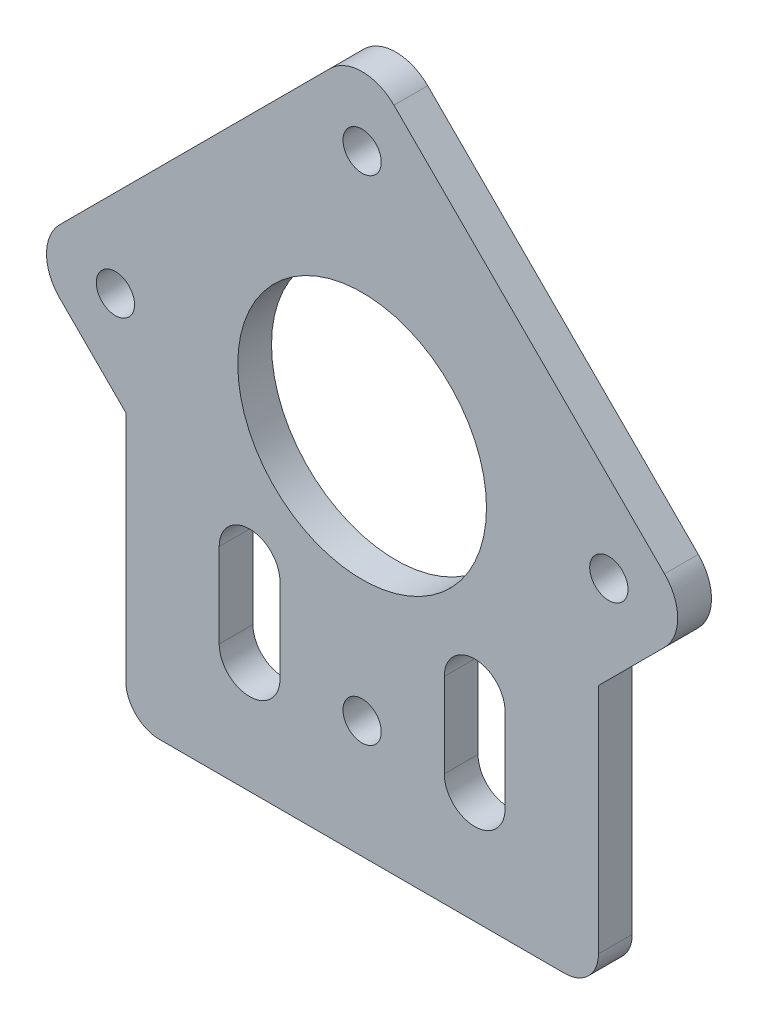
ISO-10303-21;
HEADER;
FILE_DESCRIPTION(('STEP AP214'),'2;1');
FILE_NAME('part.step','',(''),(''),'','','');
FILE_SCHEMA(('AUTOMOTIVE_DESIGN { 1 0 10303 214 1 1 1 1 }'));
ENDSEC;
DATA;
#1=APPLICATION_CONTEXT('core data for automotive mechanical design processes');
#2=APPLICATION_PROTOCOL_DEFINITION('international standard','automotive_design',2000,#1);
#3=PRODUCT_CONTEXT('',#1,'mechanical');
#4=PRODUCT('Part','Part','',(#3));
#5=PRODUCT_RELATED_PRODUCT_CATEGORY('part','',(#4));
#6=PRODUCT_DEFINITION_FORMATION('','',#4);
#7=PRODUCT_DEFINITION_CONTEXT('part definition',#1,'design');
#8=PRODUCT_DEFINITION('design','',#6,#7);
#9=PRODUCT_DEFINITION_SHAPE('','',#8);
#10=(LENGTH_UNIT() NAMED_UNIT(*) SI_UNIT(.MILLI.,.METRE.));
#11=(NAMED_UNIT(*) PLANE_ANGLE_UNIT() SI_UNIT($,.RADIAN.));
#12=(NAMED_UNIT(*) SI_UNIT($,.STERADIAN.) SOLID_ANGLE_UNIT());
#13=UNCERTAINTY_MEASURE_WITH_UNIT(LENGTH_MEASURE(1.E-05),#10,'distance_accuracy_value','');
#14=(GEOMETRIC_REPRESENTATION_CONTEXT(3) GLOBAL_UNCERTAINTY_ASSIGNED_CONTEXT((#13)) GLOBAL_UNIT_ASSIGNED_CONTEXT((#10,
#11,#12)) REPRESENTATION_CONTEXT('',''));
#15=CARTESIAN_POINT('',(0.,0.,0.));
#16=DIRECTION('',(0.,0.,1.));
#17=DIRECTION('',(1.,0.,0.));
#18=AXIS2_PLACEMENT_3D('',#15,#16,#17);
#19=CARTESIAN_POINT('',(54.0416305603426,32.35,3.));
#20=DIRECTION('',(0.,0.,1.));
#21=DIRECTION('',(1.,0.,0.));
#22=AXIS2_PLACEMENT_3D('',#19,#20,#21);
#23=PLANE('',#22);
#24=DIRECTION('',(0.,-1.,0.));
#25=VECTOR('',#24,1.);
#26=CARTESIAN_POINT('',(17.3,17.5,3.));
#27=LINE('',#26,#25);
#28=CARTESIAN_POINT('',(17.3,17.5,3.));
#29=VERTEX_POINT('',#28);
#30=CARTESIAN_POINT('',(17.3,10.,3.));
#31=VERTEX_POINT('',#30);
#32=EDGE_CURVE('E208',#29,#31,#27,.T.);
#33=ORIENTED_EDGE('',*,*,#32,.F.);
#34=CARTESIAN_POINT('',(20.,17.5,3.));
#35=DIRECTION('',(0.,0.,1.));
#36=DIRECTION('',(1.,0.,0.));
#37=AXIS2_PLACEMENT_3D('',#34,#35,#36);
#38=CIRCLE('',#37,2.7);
#39=CARTESIAN_POINT('',(22.7,17.5,3.));
#40=VERTEX_POINT('',#39);
#41=EDGE_CURVE('E206',#40,#29,#38,.T.);
#42=ORIENTED_EDGE('',*,*,#41,.F.);
#43=DIRECTION('',(0.,1.,0.));
#44=VECTOR('',#43,1.);
#45=CARTESIAN_POINT('',(22.7,10.,3.));
#46=LINE('',#45,#44);
#47=CARTESIAN_POINT('',(22.7,10.,3.));
#48=VERTEX_POINT('',#47);
#49=EDGE_CURVE('E214',#48,#40,#46,.T.);
#50=ORIENTED_EDGE('',*,*,#49,.F.);
#51=CARTESIAN_POINT('',(20.,10.,3.));
#52=DIRECTION('',(0.,0.,1.));
#53=DIRECTION('',(1.,0.,0.));
#54=AXIS2_PLACEMENT_3D('',#51,#52,#53);
#55=CIRCLE('',#54,2.7);
#56=EDGE_CURVE('E211',#31,#48,#55,.T.);
#57=ORIENTED_EDGE('',*,*,#56,.F.);
#58=EDGE_LOOP('',(#33,#42,#50,#57));
#59=FACE_BOUND('',#58,.T.);
#60=CARTESIAN_POINT('',(8.07968978321703,32.35,3.));
#61=DIRECTION('',(0.,0.,1.));
#62=DIRECTION('',(1.,0.,0.));
#63=AXIS2_PLACEMENT_3D('',#60,#61,#62);
#64=CIRCLE('',#63,1.7);
#65=CARTESIAN_POINT('',(9.77968978321703,32.35,3.));
#66=VERTEX_POINT('',#65);
#67=EDGE_CURVE('E243',#66,#66,#64,.T.);
#68=ORIENTED_EDGE('',*,*,#67,.F.);
#69=EDGE_LOOP('',(#68));
#70=FACE_BOUND('',#69,.T.);
#71=CARTESIAN_POINT('',(51.920310216783,32.35,3.));
#72=DIRECTION('',(0.,0.,1.));
#73=DIRECTION('',(1.,0.,0.));
#74=AXIS2_PLACEMENT_3D('',#71,#72,#73);
#75=CIRCLE('',#74,1.7);
#76=CARTESIAN_POINT('',(53.620310216783,32.35,3.));
#77=VERTEX_POINT('',#76);
#78=EDGE_CURVE('E255',#77,#77,#75,.T.);
#79=ORIENTED_EDGE('',*,*,#78,.F.);
#80=EDGE_LOOP('',(#79));
#81=FACE_BOUND('',#80,.T.);
#82=CARTESIAN_POINT('',(54.0416305603426,32.35,3.));
#83=DIRECTION('',(0.,0.,1.));
#84=DIRECTION('',(1.,0.,0.));
#85=AXIS2_PLACEMENT_3D('',#82,#83,#84);
#86=CIRCLE('',#85,4.);
#87=CARTESIAN_POINT('',(56.8700576850888,29.5215728752538,3.));
#88=VERTEX_POINT('',#87);
#89=CARTESIAN_POINT('',(56.8700576850888,35.1784271247462,3.));
#90=VERTEX_POINT('',#89);
#91=EDGE_CURVE('E267',#88,#90,#86,.T.);
#92=ORIENTED_EDGE('',*,*,#91,.T.);
#93=DIRECTION('',(-0.707106781186548,0.707106781186547,0.));
#94=VECTOR('',#93,1.);
#95=CARTESIAN_POINT('',(56.8700576850888,35.1784271247462,3.));
#96=LINE('',#95,#94);
#97=CARTESIAN_POINT('',(32.8284271247462,59.2200576850888,3.));
#98=VERTEX_POINT('',#97);
#99=EDGE_CURVE('E270',#90,#98,#96,.T.);
#100=ORIENTED_EDGE('',*,*,#99,.T.);
#101=CARTESIAN_POINT('',(30.,56.3916305603426,3.));
#102=DIRECTION('',(0.,0.,1.));
#103=DIRECTION('',(1.,0.,0.));
#104=AXIS2_PLACEMENT_3D('',#101,#102,#103);
#105=CIRCLE('',#104,4.);
#106=CARTESIAN_POINT('',(27.1715728752538,59.2200576850888,3.));
#107=VERTEX_POINT('',#106);
#108=EDGE_CURVE('E273',#98,#107,#105,.T.);
#109=ORIENTED_EDGE('',*,*,#108,.T.);
#110=DIRECTION('',(-0.707106781186547,-0.707106781186547,0.));
#111=VECTOR('',#110,1.);
#112=CARTESIAN_POINT('',(27.1715728752538,59.2200576850888,3.));
#113=LINE('',#112,#111);
#114=CARTESIAN_POINT('',(3.1299423149112,35.1784271247462,3.));
#115=VERTEX_POINT('',#114);
#116=EDGE_CURVE('E275',#107,#115,#113,.T.);
#117=ORIENTED_EDGE('',*,*,#116,.T.);
#118=CARTESIAN_POINT('',(5.95836943965739,32.35,3.));
#119=DIRECTION('',(0.,0.,1.));
#120=DIRECTION('',(1.,0.,0.));
#121=AXIS2_PLACEMENT_3D('',#118,#119,#120);
#122=CIRCLE('',#121,4.);
#123=CARTESIAN_POINT('',(3.1299423149112,29.5215728752538,3.));
#124=VERTEX_POINT('',#123);
#125=EDGE_CURVE('E277',#115,#124,#122,.T.);
#126=ORIENTED_EDGE('',*,*,#125,.T.);
#127=DIRECTION('',(0.707106781186548,-0.707106781186547,0.));
#128=VECTOR('',#127,1.);
#129=CARTESIAN_POINT('',(3.1299423149112,29.5215728752538,3.));
#130=LINE('',#129,#128);
#131=CARTESIAN_POINT('',(9.,23.651515190165,3.));
#132=VERTEX_POINT('',#131);
#133=EDGE_CURVE('E279',#124,#132,#130,.T.);
#134=ORIENTED_EDGE('',*,*,#133,.T.);
#135=DIRECTION('',(0.,-1.,0.));
#136=VECTOR('',#135,1.);
#137=CARTESIAN_POINT('',(9.,23.651515190165,3.));
#138=LINE('',#137,#136);
#139=CARTESIAN_POINT('',(9.,3.,3.));
#140=VERTEX_POINT('',#139);
#141=EDGE_CURVE('E281',#132,#140,#138,.T.);
#142=ORIENTED_EDGE('',*,*,#141,.T.);
#143=CARTESIAN_POINT('',(12.,3.,3.));
#144=DIRECTION('',(0.,0.,1.));
#145=DIRECTION('',(1.,0.,0.));
#146=AXIS2_PLACEMENT_3D('',#143,#144,#145);
#147=CIRCLE('',#146,3.);
#148=CARTESIAN_POINT('',(12.,0.,3.));
#149=VERTEX_POINT('',#148);
#150=EDGE_CURVE('E283',#140,#149,#147,.T.);
#151=ORIENTED_EDGE('',*,*,#150,.T.);
#152=DIRECTION('',(1.,0.,0.));
#153=VECTOR('',#152,1.);
#154=CARTESIAN_POINT('',(12.,0.,3.));
#155=LINE('',#154,#153);
#156=CARTESIAN_POINT('',(48.,0.,3.));
#157=VERTEX_POINT('',#156);
#158=EDGE_CURVE('E285',#149,#157,#155,.T.);
#159=ORIENTED_EDGE('',*,*,#158,.T.);
#160=CARTESIAN_POINT('',(48.,3.,3.));
#161=DIRECTION('',(0.,0.,1.));
#162=DIRECTION('',(1.,0.,0.));
#163=AXIS2_PLACEMENT_3D('',#160,#161,#162);
#164=CIRCLE('',#163,3.);
#165=CARTESIAN_POINT('',(51.,3.,3.));
#166=VERTEX_POINT('',#165);
#167=EDGE_CURVE('E287',#157,#166,#164,.T.);
#168=ORIENTED_EDGE('',*,*,#167,.T.);
#169=DIRECTION('',(0.,1.,0.));
#170=VECTOR('',#169,1.);
#171=CARTESIAN_POINT('',(51.,3.,3.));
#172=LINE('',#171,#170);
#173=CARTESIAN_POINT('',(51.,23.651515190165,3.));
#174=VERTEX_POINT('',#173);
#175=EDGE_CURVE('E289',#166,#174,#172,.T.);
#176=ORIENTED_EDGE('',*,*,#175,.T.);
#177=DIRECTION('',(0.707106781186547,0.707106781186547,0.));
#178=VECTOR('',#177,1.);
#179=CARTESIAN_POINT('',(51.,23.651515190165,3.));
#180=LINE('',#179,#178);
#181=EDGE_CURVE('E291',#174,#88,#180,.T.);
#182=ORIENTED_EDGE('',*,*,#181,.T.);
#183=EDGE_LOOP('',(#92,#100,#109,#117,#126,#134,#142,#151,#159,#168,#176,#182));
#184=FACE_BOUND('',#183,.T.);
#185=CARTESIAN_POINT('',(30.,10.429689783217,3.));
#186=DIRECTION('',(0.,0.,1.));
#187=DIRECTION('',(1.,0.,0.));
#188=AXIS2_PLACEMENT_3D('',#185,#186,#187);
#189=CIRCLE('',#188,1.7);
#190=CARTESIAN_POINT('',(31.7,10.429689783217,3.));
#191=VERTEX_POINT('',#190);
#192=EDGE_CURVE('E261',#191,#191,#189,.T.);
#193=ORIENTED_EDGE('',*,*,#192,.F.);
#194=EDGE_LOOP('',(#193));
#195=FACE_BOUND('',#194,.T.);
#196=CARTESIAN_POINT('',(30.,54.270310216783,3.));
#197=DIRECTION('',(0.,0.,1.));
#198=DIRECTION('',(1.,0.,0.));
#199=AXIS2_PLACEMENT_3D('',#196,#197,#198);
#200=CIRCLE('',#199,1.7);
#201=CARTESIAN_POINT('',(31.7,54.270310216783,3.));
#202=VERTEX_POINT('',#201);
#203=EDGE_CURVE('E249',#202,#202,#200,.T.);
#204=ORIENTED_EDGE('',*,*,#203,.F.);
#205=EDGE_LOOP('',(#204));
#206=FACE_BOUND('',#205,.T.);
#207=CARTESIAN_POINT('',(30.,32.35,3.));
#208=DIRECTION('',(0.,0.,1.));
#209=DIRECTION('',(1.,0.,0.));
#210=AXIS2_PLACEMENT_3D('',#207,#208,#209);
#211=CIRCLE('',#210,11.05);
#212=CARTESIAN_POINT('',(41.05,32.35,3.));
#213=VERTEX_POINT('',#212);
#214=EDGE_CURVE('E237',#213,#213,#211,.T.);
#215=ORIENTED_EDGE('',*,*,#214,.F.);
#216=EDGE_LOOP('',(#215));
#217=FACE_BOUND('',#216,.T.);
#218=DIRECTION('',(0.,-1.,0.));
#219=VECTOR('',#218,1.);
#220=CARTESIAN_POINT('',(37.3,10.,3.));
#221=LINE('',#220,#219);
#222=CARTESIAN_POINT('',(37.3,17.5,3.));
#223=VERTEX_POINT('',#222);
#224=CARTESIAN_POINT('',(37.3,10.,3.));
#225=VERTEX_POINT('',#224);
#226=EDGE_CURVE('E178',#223,#225,#221,.T.);
#227=ORIENTED_EDGE('',*,*,#226,.F.);
#228=CARTESIAN_POINT('',(40.,17.5,3.));
#229=DIRECTION('',(0.,0.,1.));
#230=DIRECTION('',(1.,0.,0.));
#231=AXIS2_PLACEMENT_3D('',#228,#229,#230);
#232=CIRCLE('',#231,2.7);
#233=CARTESIAN_POINT('',(42.7,17.5,3.));
#234=VERTEX_POINT('',#233);
#235=EDGE_CURVE('E170',#234,#223,#232,.T.);
#236=ORIENTED_EDGE('',*,*,#235,.F.);
#237=DIRECTION('',(0.,1.,0.));
#238=VECTOR('',#237,1.);
#239=CARTESIAN_POINT('',(42.7,17.5,3.));
#240=LINE('',#239,#238);
#241=CARTESIAN_POINT('',(42.7,10.,3.));
#242=VERTEX_POINT('',#241);
#243=EDGE_CURVE('E192',#242,#234,#240,.T.);
#244=ORIENTED_EDGE('',*,*,#243,.F.);
#245=CARTESIAN_POINT('',(40.,10.,3.));
#246=DIRECTION('',(0.,0.,1.));
#247=DIRECTION('',(1.,0.,0.));
#248=AXIS2_PLACEMENT_3D('',#245,#246,#247);
#249=CIRCLE('',#248,2.7);
#250=EDGE_CURVE('E190',#225,#242,#249,.T.);
#251=ORIENTED_EDGE('',*,*,#250,.F.);
#252=EDGE_LOOP('',(#227,#236,#244,#251));
#253=FACE_BOUND('',#252,.T.);
#254=ADVANCED_FACE('F33',(#59,#70,#81,#184,#195,#206,#217,#253),#23,.T.);
#255=CARTESIAN_POINT('',(54.0416305603426,32.35,0.));
#256=DIRECTION('',(0.,0.,1.));
#257=DIRECTION('',(1.,0.,0.));
#258=AXIS2_PLACEMENT_3D('',#255,#256,#257);
#259=PLANE('',#258);
#260=CARTESIAN_POINT('',(20.,17.5,0.));
#261=DIRECTION('',(0.,0.,1.));
#262=DIRECTION('',(1.,0.,0.));
#263=AXIS2_PLACEMENT_3D('',#260,#261,#262);
#264=CIRCLE('',#263,2.7);
#265=CARTESIAN_POINT('',(22.7,17.5,0.));
#266=VERTEX_POINT('',#265);
#267=CARTESIAN_POINT('',(17.3,17.5,0.));
#268=VERTEX_POINT('',#267);
#269=EDGE_CURVE('E186',#266,#268,#264,.T.);
#270=ORIENTED_EDGE('',*,*,#269,.T.);
#271=DIRECTION('',(0.,-1.,0.));
#272=VECTOR('',#271,1.);
#273=CARTESIAN_POINT('',(17.3,17.5,0.));
#274=LINE('',#273,#272);
#275=CARTESIAN_POINT('',(17.3,10.,0.));
#276=VERTEX_POINT('',#275);
#277=EDGE_CURVE('E219',#268,#276,#274,.T.);
#278=ORIENTED_EDGE('',*,*,#277,.T.);
#279=CARTESIAN_POINT('',(20.,10.,0.));
#280=DIRECTION('',(0.,0.,1.));
#281=DIRECTION('',(1.,0.,0.));
#282=AXIS2_PLACEMENT_3D('',#279,#280,#281);
#283=CIRCLE('',#282,2.7);
#284=CARTESIAN_POINT('',(22.7,10.,0.));
#285=VERTEX_POINT('',#284);
#286=EDGE_CURVE('E222',#276,#285,#283,.T.);
#287=ORIENTED_EDGE('',*,*,#286,.T.);
#288=DIRECTION('',(0.,1.,0.));
#289=VECTOR('',#288,1.);
#290=CARTESIAN_POINT('',(22.7,10.,0.));
#291=LINE('',#290,#289);
#292=EDGE_CURVE('E209',#285,#266,#291,.T.);
#293=ORIENTED_EDGE('',*,*,#292,.T.);
#294=EDGE_LOOP('',(#270,#278,#287,#293));
#295=FACE_BOUND('',#294,.T.);
#296=CARTESIAN_POINT('',(8.07968978321703,32.35,0.));
#297=DIRECTION('',(0.,0.,1.));
#298=DIRECTION('',(1.,0.,0.));
#299=AXIS2_PLACEMENT_3D('',#296,#297,#298);
#300=CIRCLE('',#299,1.7);
#301=CARTESIAN_POINT('',(9.77968978321703,32.35,0.));
#302=VERTEX_POINT('',#301);
#303=EDGE_CURVE('E240',#302,#302,#300,.T.);
#304=ORIENTED_EDGE('',*,*,#303,.T.);
#305=EDGE_LOOP('',(#304));
#306=FACE_BOUND('',#305,.T.);
#307=CARTESIAN_POINT('',(51.920310216783,32.35,0.));
#308=DIRECTION('',(0.,0.,1.));
#309=DIRECTION('',(1.,0.,0.));
#310=AXIS2_PLACEMENT_3D('',#307,#308,#309);
#311=CIRCLE('',#310,1.7);
#312=CARTESIAN_POINT('',(53.620310216783,32.35,0.));
#313=VERTEX_POINT('',#312);
#314=EDGE_CURVE('E252',#313,#313,#311,.T.);
#315=ORIENTED_EDGE('',*,*,#314,.T.);
#316=EDGE_LOOP('',(#315));
#317=FACE_BOUND('',#316,.T.);
#318=CARTESIAN_POINT('',(54.0416305603426,32.35,0.));
#319=DIRECTION('',(0.,0.,1.));
#320=DIRECTION('',(1.,0.,0.));
#321=AXIS2_PLACEMENT_3D('',#318,#319,#320);
#322=CIRCLE('',#321,4.);
#323=CARTESIAN_POINT('',(56.8700576850888,29.5215728752538,0.));
#324=VERTEX_POINT('',#323);
#325=CARTESIAN_POINT('',(56.8700576850888,35.1784271247462,0.));
#326=VERTEX_POINT('',#325);
#327=EDGE_CURVE('E264',#324,#326,#322,.T.);
#328=ORIENTED_EDGE('',*,*,#327,.F.);
#329=DIRECTION('',(0.707106781186547,0.707106781186547,0.));
#330=VECTOR('',#329,1.);
#331=CARTESIAN_POINT('',(51.,23.651515190165,0.));
#332=LINE('',#331,#330);
#333=CARTESIAN_POINT('',(51.,23.651515190165,0.));
#334=VERTEX_POINT('',#333);
#335=EDGE_CURVE('E271',#334,#324,#332,.T.);
#336=ORIENTED_EDGE('',*,*,#335,.F.);
#337=DIRECTION('',(0.,1.,0.));
#338=VECTOR('',#337,1.);
#339=CARTESIAN_POINT('',(51.,3.,0.));
#340=LINE('',#339,#338);
#341=CARTESIAN_POINT('',(51.,3.,0.));
#342=VERTEX_POINT('',#341);
#343=EDGE_CURVE('E314',#342,#334,#340,.T.);
#344=ORIENTED_EDGE('',*,*,#343,.F.);
#345=CARTESIAN_POINT('',(48.,3.,0.));
#346=DIRECTION('',(0.,0.,1.));
#347=DIRECTION('',(1.,0.,0.));
#348=AXIS2_PLACEMENT_3D('',#345,#346,#347);
#349=CIRCLE('',#348,3.);
#350=CARTESIAN_POINT('',(48.,0.,0.));
#351=VERTEX_POINT('',#350);
#352=EDGE_CURVE('E312',#351,#342,#349,.T.);
#353=ORIENTED_EDGE('',*,*,#352,.F.);
#354=DIRECTION('',(1.,0.,0.));
#355=VECTOR('',#354,1.);
#356=CARTESIAN_POINT('',(12.,0.,0.));
#357=LINE('',#356,#355);
#358=CARTESIAN_POINT('',(12.,0.,0.));
#359=VERTEX_POINT('',#358);
#360=EDGE_CURVE('E310',#359,#351,#357,.T.);
#361=ORIENTED_EDGE('',*,*,#360,.F.);
#362=CARTESIAN_POINT('',(12.,3.,0.));
#363=DIRECTION('',(0.,0.,1.));
#364=DIRECTION('',(1.,0.,0.));
#365=AXIS2_PLACEMENT_3D('',#362,#363,#364);
#366=CIRCLE('',#365,3.);
#367=CARTESIAN_POINT('',(9.,3.,0.));
#368=VERTEX_POINT('',#367);
#369=EDGE_CURVE('E308',#368,#359,#366,.T.);
#370=ORIENTED_EDGE('',*,*,#369,.F.);
#371=DIRECTION('',(0.,-1.,0.));
#372=VECTOR('',#371,1.);
#373=CARTESIAN_POINT('',(9.,23.651515190165,0.));
#374=LINE('',#373,#372);
#375=CARTESIAN_POINT('',(9.,23.651515190165,0.));
#376=VERTEX_POINT('',#375);
#377=EDGE_CURVE('E306',#376,#368,#374,.T.);
#378=ORIENTED_EDGE('',*,*,#377,.F.);
#379=DIRECTION('',(0.707106781186548,-0.707106781186547,0.));
#380=VECTOR('',#379,1.);
#381=CARTESIAN_POINT('',(3.1299423149112,29.5215728752538,0.));
#382=LINE('',#381,#380);
#383=CARTESIAN_POINT('',(3.1299423149112,29.5215728752538,0.));
#384=VERTEX_POINT('',#383);
#385=EDGE_CURVE('E304',#384,#376,#382,.T.);
#386=ORIENTED_EDGE('',*,*,#385,.F.);
#387=CARTESIAN_POINT('',(5.95836943965739,32.35,0.));
#388=DIRECTION('',(0.,0.,1.));
#389=DIRECTION('',(1.,0.,0.));
#390=AXIS2_PLACEMENT_3D('',#387,#388,#389);
#391=CIRCLE('',#390,4.);
#392=CARTESIAN_POINT('',(3.1299423149112,35.1784271247462,0.));
#393=VERTEX_POINT('',#392);
#394=EDGE_CURVE('E302',#393,#384,#391,.T.);
#395=ORIENTED_EDGE('',*,*,#394,.F.);
#396=DIRECTION('',(-0.707106781186547,-0.707106781186547,0.));
#397=VECTOR('',#396,1.);
#398=CARTESIAN_POINT('',(27.1715728752538,59.2200576850888,0.));
#399=LINE('',#398,#397);
#400=CARTESIAN_POINT('',(27.1715728752538,59.2200576850888,0.));
#401=VERTEX_POINT('',#400);
#402=EDGE_CURVE('E300',#401,#393,#399,.T.);
#403=ORIENTED_EDGE('',*,*,#402,.F.);
#404=CARTESIAN_POINT('',(30.,56.3916305603426,0.));
#405=DIRECTION('',(0.,0.,1.));
#406=DIRECTION('',(1.,0.,0.));
#407=AXIS2_PLACEMENT_3D('',#404,#405,#406);
#408=CIRCLE('',#407,4.);
#409=CARTESIAN_POINT('',(32.8284271247462,59.2200576850888,0.));
#410=VERTEX_POINT('',#409);
#411=EDGE_CURVE('E298',#410,#401,#408,.T.);
#412=ORIENTED_EDGE('',*,*,#411,.F.);
#413=DIRECTION('',(-0.707106781186548,0.707106781186547,0.));
#414=VECTOR('',#413,1.);
#415=CARTESIAN_POINT('',(56.8700576850888,35.1784271247462,0.));
#416=LINE('',#415,#414);
#417=EDGE_CURVE('E296',#326,#410,#416,.T.);
#418=ORIENTED_EDGE('',*,*,#417,.F.);
#419=EDGE_LOOP('',(#328,#336,#344,#353,#361,#370,#378,#386,#395,#403,#412,#418));
#420=FACE_BOUND('',#419,.T.);
#421=CARTESIAN_POINT('',(30.,10.429689783217,0.));
#422=DIRECTION('',(0.,0.,1.));
#423=DIRECTION('',(1.,0.,0.));
#424=AXIS2_PLACEMENT_3D('',#421,#422,#423);
#425=CIRCLE('',#424,1.7);
#426=CARTESIAN_POINT('',(31.7,10.429689783217,0.));
#427=VERTEX_POINT('',#426);
#428=EDGE_CURVE('E258',#427,#427,#425,.T.);
#429=ORIENTED_EDGE('',*,*,#428,.T.);
#430=EDGE_LOOP('',(#429));
#431=FACE_BOUND('',#430,.T.);
#432=CARTESIAN_POINT('',(30.,54.270310216783,0.));
#433=DIRECTION('',(0.,0.,1.));
#434=DIRECTION('',(1.,0.,0.));
#435=AXIS2_PLACEMENT_3D('',#432,#433,#434);
#436=CIRCLE('',#435,1.7);
#437=CARTESIAN_POINT('',(31.7,54.270310216783,0.));
#438=VERTEX_POINT('',#437);
#439=EDGE_CURVE('E246',#438,#438,#436,.T.);
#440=ORIENTED_EDGE('',*,*,#439,.T.);
#441=EDGE_LOOP('',(#440));
#442=FACE_BOUND('',#441,.T.);
#443=CARTESIAN_POINT('',(30.,32.35,0.));
#444=DIRECTION('',(0.,0.,1.));
#445=DIRECTION('',(1.,0.,0.));
#446=AXIS2_PLACEMENT_3D('',#443,#444,#445);
#447=CIRCLE('',#446,11.05);
#448=CARTESIAN_POINT('',(41.05,32.35,0.));
#449=VERTEX_POINT('',#448);
#450=EDGE_CURVE('E236',#449,#449,#447,.T.);
#451=ORIENTED_EDGE('',*,*,#450,.T.);
#452=EDGE_LOOP('',(#451));
#453=FACE_BOUND('',#452,.T.);
#454=CARTESIAN_POINT('',(40.,17.5,0.));
#455=DIRECTION('',(0.,0.,1.));
#456=DIRECTION('',(1.,0.,0.));
#457=AXIS2_PLACEMENT_3D('',#454,#455,#456);
#458=CIRCLE('',#457,2.7);
#459=CARTESIAN_POINT('',(42.7,17.5,0.));
#460=VERTEX_POINT('',#459);
#461=CARTESIAN_POINT('',(37.3,17.5,0.));
#462=VERTEX_POINT('',#461);
#463=EDGE_CURVE('E56',#460,#462,#458,.T.);
#464=ORIENTED_EDGE('',*,*,#463,.T.);
#465=DIRECTION('',(0.,-1.,0.));
#466=VECTOR('',#465,1.);
#467=CARTESIAN_POINT('',(37.3,10.,0.));
#468=LINE('',#467,#466);
#469=CARTESIAN_POINT('',(37.3,10.,0.));
#470=VERTEX_POINT('',#469);
#471=EDGE_CURVE('E185',#462,#470,#468,.T.);
#472=ORIENTED_EDGE('',*,*,#471,.T.);
#473=CARTESIAN_POINT('',(40.,10.,0.));
#474=DIRECTION('',(0.,0.,1.));
#475=DIRECTION('',(1.,0.,0.));
#476=AXIS2_PLACEMENT_3D('',#473,#474,#475);
#477=CIRCLE('',#476,2.7);
#478=CARTESIAN_POINT('',(42.7,10.,0.));
#479=VERTEX_POINT('',#478);
#480=EDGE_CURVE('E198',#470,#479,#477,.T.);
#481=ORIENTED_EDGE('',*,*,#480,.T.);
#482=DIRECTION('',(0.,1.,0.));
#483=VECTOR('',#482,1.);
#484=CARTESIAN_POINT('',(42.7,17.5,0.));
#485=LINE('',#484,#483);
#486=EDGE_CURVE('E179',#479,#460,#485,.T.);
#487=ORIENTED_EDGE('',*,*,#486,.T.);
#488=EDGE_LOOP('',(#464,#472,#481,#487));
#489=FACE_BOUND('',#488,.T.);
#490=ADVANCED_FACE('F356',(#295,#306,#317,#420,#431,#442,#453,#489),#259,.F.);
#491=CARTESIAN_POINT('',(54.0416305603426,32.35,3.));
#492=DIRECTION('',(0.,0.,-1.));
#493=DIRECTION('',(-1.,0.,0.));
#494=AXIS2_PLACEMENT_3D('',#491,#492,#493);
#495=CYLINDRICAL_SURFACE('',#494,4.);
#496=ORIENTED_EDGE('',*,*,#327,.T.);
#497=DIRECTION('',(0.,0.,-1.));
#498=VECTOR('',#497,1.);
#499=CARTESIAN_POINT('',(56.8700576850888,35.1784271247462,3.));
#500=LINE('',#499,#498);
#501=EDGE_CURVE('E11',#90,#326,#500,.T.);
#502=ORIENTED_EDGE('',*,*,#501,.F.);
#503=ORIENTED_EDGE('',*,*,#91,.F.);
#504=DIRECTION('',(0.,0.,-1.));
#505=VECTOR('',#504,1.);
#506=CARTESIAN_POINT('',(56.8700576850888,29.5215728752538,3.));
#507=LINE('',#506,#505);
#508=EDGE_CURVE('E293',#88,#324,#507,.T.);
#509=ORIENTED_EDGE('',*,*,#508,.T.);
#510=EDGE_LOOP('',(#496,#502,#503,#509));
#511=FACE_BOUND('',#510,.T.);
#512=ADVANCED_FACE('F35',(#511),#495,.T.);
#513=CARTESIAN_POINT('',(56.8700576850888,35.1784271247462,3.));
#514=DIRECTION('',(-0.707106781186547,-0.707106781186548,0.));
#515=DIRECTION('',(0.707106781186548,-0.707106781186547,0.));
#516=AXIS2_PLACEMENT_3D('',#513,#514,#515);
#517=PLANE('',#516);
#518=ORIENTED_EDGE('',*,*,#417,.T.);
#519=DIRECTION('',(0.,0.,-1.));
#520=VECTOR('',#519,1.);
#521=CARTESIAN_POINT('',(32.8284271247462,59.2200576850888,3.));
#522=LINE('',#521,#520);
#523=EDGE_CURVE('E41',#98,#410,#522,.T.);
#524=ORIENTED_EDGE('',*,*,#523,.F.);
#525=ORIENTED_EDGE('',*,*,#99,.F.);
#526=ORIENTED_EDGE('',*,*,#501,.T.);
#527=EDGE_LOOP('',(#518,#524,#525,#526));
#528=FACE_BOUND('',#527,.T.);
#529=ADVANCED_FACE('F374',(#528),#517,.F.);
#530=CARTESIAN_POINT('',(30.,56.3916305603426,3.));
#531=DIRECTION('',(0.,0.,-1.));
#532=DIRECTION('',(-1.,0.,0.));
#533=AXIS2_PLACEMENT_3D('',#530,#531,#532);
#534=CYLINDRICAL_SURFACE('',#533,4.);
#535=ORIENTED_EDGE('',*,*,#411,.T.);
#536=DIRECTION('',(0.,0.,-1.));
#537=VECTOR('',#536,1.);
#538=CARTESIAN_POINT('',(27.1715728752538,59.2200576850888,3.));
#539=LINE('',#538,#537);
#540=EDGE_CURVE('E343',#107,#401,#539,.T.);
#541=ORIENTED_EDGE('',*,*,#540,.F.);
#542=ORIENTED_EDGE('',*,*,#108,.F.);
#543=ORIENTED_EDGE('',*,*,#523,.T.);
#544=EDGE_LOOP('',(#535,#541,#542,#543));
#545=FACE_BOUND('',#544,.T.);
#546=ADVANCED_FACE('F350',(#545),#534,.T.);
#547=CARTESIAN_POINT('',(27.1715728752538,59.2200576850888,3.));
#548=DIRECTION('',(0.707106781186548,-0.707106781186548,0.));
#549=DIRECTION('',(0.707106781186548,0.707106781186548,0.));
#550=AXIS2_PLACEMENT_3D('',#547,#548,#549);
#551=PLANE('',#550);
#552=ORIENTED_EDGE('',*,*,#402,.T.);
#553=DIRECTION('',(0.,0.,-1.));
#554=VECTOR('',#553,1.);
#555=CARTESIAN_POINT('',(3.1299423149112,35.1784271247462,3.));
#556=LINE('',#555,#554);
#557=EDGE_CURVE('E340',#115,#393,#556,.T.);
#558=ORIENTED_EDGE('',*,*,#557,.F.);
#559=ORIENTED_EDGE('',*,*,#116,.F.);
#560=ORIENTED_EDGE('',*,*,#540,.T.);
#561=EDGE_LOOP('',(#552,#558,#559,#560));
#562=FACE_BOUND('',#561,.T.);
#563=ADVANCED_FACE('F362',(#562),#551,.F.);
#564=CARTESIAN_POINT('',(5.95836943965739,32.35,3.));
#565=DIRECTION('',(0.,0.,-1.));
#566=DIRECTION('',(-1.,0.,0.));
#567=AXIS2_PLACEMENT_3D('',#564,#565,#566);
#568=CYLINDRICAL_SURFACE('',#567,4.);
#569=ORIENTED_EDGE('',*,*,#394,.T.);
#570=DIRECTION('',(0.,0.,-1.));
#571=VECTOR('',#570,1.);
#572=CARTESIAN_POINT('',(3.1299423149112,29.5215728752538,3.));
#573=LINE('',#572,#571);
#574=EDGE_CURVE('E337',#124,#384,#573,.T.);
#575=ORIENTED_EDGE('',*,*,#574,.F.);
#576=ORIENTED_EDGE('',*,*,#125,.F.);
#577=ORIENTED_EDGE('',*,*,#557,.T.);
#578=EDGE_LOOP('',(#569,#575,#576,#577));
#579=FACE_BOUND('',#578,.T.);
#580=ADVANCED_FACE('F366',(#579),#568,.T.);
#581=CARTESIAN_POINT('',(3.1299423149112,29.5215728752538,3.));
#582=DIRECTION('',(0.707106781186547,0.707106781186548,0.));
#583=DIRECTION('',(-0.707106781186548,0.707106781186547,0.));
#584=AXIS2_PLACEMENT_3D('',#581,#582,#583);
#585=PLANE('',#584);
#586=ORIENTED_EDGE('',*,*,#385,.T.);
#587=DIRECTION('',(0.,0.,-1.));
#588=VECTOR('',#587,1.);
#589=CARTESIAN_POINT('',(9.,23.651515190165,3.));
#590=LINE('',#589,#588);
#591=EDGE_CURVE('E334',#132,#376,#590,.T.);
#592=ORIENTED_EDGE('',*,*,#591,.F.);
#593=ORIENTED_EDGE('',*,*,#133,.F.);
#594=ORIENTED_EDGE('',*,*,#574,.T.);
#595=EDGE_LOOP('',(#586,#592,#593,#594));
#596=FACE_BOUND('',#595,.T.);
#597=ADVANCED_FACE('F407',(#596),#585,.F.);
#598=CARTESIAN_POINT('',(9.,23.651515190165,3.));
#599=DIRECTION('',(1.,0.,0.));
#600=DIRECTION('',(0.,0.,-1.));
#601=AXIS2_PLACEMENT_3D('',#598,#599,#600);
#602=PLANE('',#601);
#603=ORIENTED_EDGE('',*,*,#377,.T.);
#604=DIRECTION('',(0.,0.,-1.));
#605=VECTOR('',#604,1.);
#606=CARTESIAN_POINT('',(9.,3.,3.));
#607=LINE('',#606,#605);
#608=EDGE_CURVE('E331',#140,#368,#607,.T.);
#609=ORIENTED_EDGE('',*,*,#608,.F.);
#610=ORIENTED_EDGE('',*,*,#141,.F.);
#611=ORIENTED_EDGE('',*,*,#591,.T.);
#612=EDGE_LOOP('',(#603,#609,#610,#611));
#613=FACE_BOUND('',#612,.T.);
#614=ADVANCED_FACE('F405',(#613),#602,.F.);
#615=CARTESIAN_POINT('',(12.,3.,3.));
#616=DIRECTION('',(0.,0.,-1.));
#617=DIRECTION('',(-1.,0.,0.));
#618=AXIS2_PLACEMENT_3D('',#615,#616,#617);
#619=CYLINDRICAL_SURFACE('',#618,3.);
#620=ORIENTED_EDGE('',*,*,#369,.T.);
#621=DIRECTION('',(0.,0.,-1.));
#622=VECTOR('',#621,1.);
#623=CARTESIAN_POINT('',(12.,0.,3.));
#624=LINE('',#623,#622);
#625=EDGE_CURVE('E328',#149,#359,#624,.T.);
#626=ORIENTED_EDGE('',*,*,#625,.F.);
#627=ORIENTED_EDGE('',*,*,#150,.F.);
#628=ORIENTED_EDGE('',*,*,#608,.T.);
#629=EDGE_LOOP('',(#620,#626,#627,#628));
#630=FACE_BOUND('',#629,.T.);
#631=ADVANCED_FACE('F401',(#630),#619,.T.);
#632=CARTESIAN_POINT('',(12.,0.,3.));
#633=DIRECTION('',(0.,1.,0.));
#634=DIRECTION('',(0.,0.,1.));
#635=AXIS2_PLACEMENT_3D('',#632,#633,#634);
#636=PLANE('',#635);
#637=ORIENTED_EDGE('',*,*,#360,.T.);
#638=DIRECTION('',(0.,0.,-1.));
#639=VECTOR('',#638,1.);
#640=CARTESIAN_POINT('',(48.,0.,3.));
#641=LINE('',#640,#639);
#642=EDGE_CURVE('E325',#157,#351,#641,.T.);
#643=ORIENTED_EDGE('',*,*,#642,.F.);
#644=ORIENTED_EDGE('',*,*,#158,.F.);
#645=ORIENTED_EDGE('',*,*,#625,.T.);
#646=EDGE_LOOP('',(#637,#643,#644,#645));
#647=FACE_BOUND('',#646,.T.);
#648=ADVANCED_FACE('F396',(#647),#636,.F.);
#649=CARTESIAN_POINT('',(48.,3.,3.));
#650=DIRECTION('',(0.,0.,-1.));
#651=DIRECTION('',(-1.,0.,0.));
#652=AXIS2_PLACEMENT_3D('',#649,#650,#651);
#653=CYLINDRICAL_SURFACE('',#652,3.);
#654=ORIENTED_EDGE('',*,*,#352,.T.);
#655=DIRECTION('',(0.,0.,-1.));
#656=VECTOR('',#655,1.);
#657=CARTESIAN_POINT('',(51.,3.,3.));
#658=LINE('',#657,#656);
#659=EDGE_CURVE('E322',#166,#342,#658,.T.);
#660=ORIENTED_EDGE('',*,*,#659,.F.);
#661=ORIENTED_EDGE('',*,*,#167,.F.);
#662=ORIENTED_EDGE('',*,*,#642,.T.);
#663=EDGE_LOOP('',(#654,#660,#661,#662));
#664=FACE_BOUND('',#663,.T.);
#665=ADVANCED_FACE('F390',(#664),#653,.T.);
#666=CARTESIAN_POINT('',(51.,3.,3.));
#667=DIRECTION('',(-1.,0.,0.));
#668=DIRECTION('',(0.,0.,1.));
#669=AXIS2_PLACEMENT_3D('',#666,#667,#668);
#670=PLANE('',#669);
#671=ORIENTED_EDGE('',*,*,#343,.T.);
#672=DIRECTION('',(0.,0.,-1.));
#673=VECTOR('',#672,1.);
#674=CARTESIAN_POINT('',(51.,23.651515190165,3.));
#675=LINE('',#674,#673);
#676=EDGE_CURVE('E319',#174,#334,#675,.T.);
#677=ORIENTED_EDGE('',*,*,#676,.F.);
#678=ORIENTED_EDGE('',*,*,#175,.F.);
#679=ORIENTED_EDGE('',*,*,#659,.T.);
#680=EDGE_LOOP('',(#671,#677,#678,#679));
#681=FACE_BOUND('',#680,.T.);
#682=ADVANCED_FACE('F386',(#681),#670,.F.);
#683=CARTESIAN_POINT('',(51.,23.651515190165,3.));
#684=DIRECTION('',(-0.707106781186548,0.707106781186548,0.));
#685=DIRECTION('',(-0.707106781186548,-0.707106781186548,0.));
#686=AXIS2_PLACEMENT_3D('',#683,#684,#685);
#687=PLANE('',#686);
#688=ORIENTED_EDGE('',*,*,#335,.T.);
#689=ORIENTED_EDGE('',*,*,#508,.F.);
#690=ORIENTED_EDGE('',*,*,#181,.F.);
#691=ORIENTED_EDGE('',*,*,#676,.T.);
#692=EDGE_LOOP('',(#688,#689,#690,#691));
#693=FACE_BOUND('',#692,.T.);
#694=ADVANCED_FACE('F381',(#693),#687,.F.);
#695=CARTESIAN_POINT('',(30.,10.429689783217,3.));
#696=DIRECTION('',(0.,0.,-1.));
#697=DIRECTION('',(-1.,0.,0.));
#698=AXIS2_PLACEMENT_3D('',#695,#696,#697);
#699=CYLINDRICAL_SURFACE('',#698,1.7);
#700=ORIENTED_EDGE('',*,*,#192,.T.);
#701=EDGE_LOOP('',(#700));
#702=FACE_BOUND('',#701,.T.);
#703=ORIENTED_EDGE('',*,*,#428,.F.);
#704=EDGE_LOOP('',(#703));
#705=FACE_BOUND('',#704,.T.);
#706=ADVANCED_FACE('F427',(#702,#705),#699,.F.);
#707=CARTESIAN_POINT('',(51.920310216783,32.35,3.));
#708=DIRECTION('',(0.,0.,-1.));
#709=DIRECTION('',(-1.,0.,0.));
#710=AXIS2_PLACEMENT_3D('',#707,#708,#709);
#711=CYLINDRICAL_SURFACE('',#710,1.7);
#712=ORIENTED_EDGE('',*,*,#78,.T.);
#713=EDGE_LOOP('',(#712));
#714=FACE_BOUND('',#713,.T.);
#715=ORIENTED_EDGE('',*,*,#314,.F.);
#716=EDGE_LOOP('',(#715));
#717=FACE_BOUND('',#716,.T.);
#718=ADVANCED_FACE('F465',(#714,#717),#711,.F.);
#719=CARTESIAN_POINT('',(30.,54.270310216783,3.));
#720=DIRECTION('',(0.,0.,-1.));
#721=DIRECTION('',(-1.,0.,0.));
#722=AXIS2_PLACEMENT_3D('',#719,#720,#721);
#723=CYLINDRICAL_SURFACE('',#722,1.7);
#724=ORIENTED_EDGE('',*,*,#203,.T.);
#725=EDGE_LOOP('',(#724));
#726=FACE_BOUND('',#725,.T.);
#727=ORIENTED_EDGE('',*,*,#439,.F.);
#728=EDGE_LOOP('',(#727));
#729=FACE_BOUND('',#728,.T.);
#730=ADVANCED_FACE('F472',(#726,#729),#723,.F.);
#731=CARTESIAN_POINT('',(8.07968978321703,32.35,3.));
#732=DIRECTION('',(0.,0.,-1.));
#733=DIRECTION('',(-1.,0.,0.));
#734=AXIS2_PLACEMENT_3D('',#731,#732,#733);
#735=CYLINDRICAL_SURFACE('',#734,1.7);
#736=ORIENTED_EDGE('',*,*,#67,.T.);
#737=EDGE_LOOP('',(#736));
#738=FACE_BOUND('',#737,.T.);
#739=ORIENTED_EDGE('',*,*,#303,.F.);
#740=EDGE_LOOP('',(#739));
#741=FACE_BOUND('',#740,.T.);
#742=ADVANCED_FACE('F479',(#738,#741),#735,.F.);
#743=CARTESIAN_POINT('',(30.,32.35,3.));
#744=DIRECTION('',(0.,0.,-1.));
#745=DIRECTION('',(-1.,0.,0.));
#746=AXIS2_PLACEMENT_3D('',#743,#744,#745);
#747=CYLINDRICAL_SURFACE('',#746,11.05);
#748=ORIENTED_EDGE('',*,*,#214,.T.);
#749=EDGE_LOOP('',(#748));
#750=FACE_BOUND('',#749,.T.);
#751=ORIENTED_EDGE('',*,*,#450,.F.);
#752=EDGE_LOOP('',(#751));
#753=FACE_BOUND('',#752,.T.);
#754=ADVANCED_FACE('F487',(#750,#753),#747,.F.);
#755=CARTESIAN_POINT('',(20.,17.5,3.));
#756=DIRECTION('',(0.,0.,-1.));
#757=DIRECTION('',(-1.,0.,0.));
#758=AXIS2_PLACEMENT_3D('',#755,#756,#757);
#759=CYLINDRICAL_SURFACE('',#758,2.7);
#760=ORIENTED_EDGE('',*,*,#269,.F.);
#761=DIRECTION('',(0.,0.,-1.));
#762=VECTOR('',#761,1.);
#763=CARTESIAN_POINT('',(22.7,17.5,3.));
#764=LINE('',#763,#762);
#765=EDGE_CURVE('E216',#40,#266,#764,.T.);
#766=ORIENTED_EDGE('',*,*,#765,.F.);
#767=ORIENTED_EDGE('',*,*,#41,.T.);
#768=DIRECTION('',(0.,0.,-1.));
#769=VECTOR('',#768,1.);
#770=CARTESIAN_POINT('',(17.3,17.5,3.));
#771=LINE('',#770,#769);
#772=EDGE_CURVE('E233',#29,#268,#771,.T.);
#773=ORIENTED_EDGE('',*,*,#772,.T.);
#774=EDGE_LOOP('',(#760,#766,#767,#773));
#775=FACE_BOUND('',#774,.T.);
#776=ADVANCED_FACE('F495',(#775),#759,.F.);
#777=CARTESIAN_POINT('',(17.3,17.5,3.));
#778=DIRECTION('',(1.,0.,0.));
#779=DIRECTION('',(0.,1.,0.));
#780=AXIS2_PLACEMENT_3D('',#777,#778,#779);
#781=PLANE('',#780);
#782=ORIENTED_EDGE('',*,*,#277,.F.);
#783=ORIENTED_EDGE('',*,*,#772,.F.);
#784=ORIENTED_EDGE('',*,*,#32,.T.);
#785=DIRECTION('',(0.,0.,-1.));
#786=VECTOR('',#785,1.);
#787=CARTESIAN_POINT('',(17.3,10.,3.));
#788=LINE('',#787,#786);
#789=EDGE_CURVE('E231',#31,#276,#788,.T.);
#790=ORIENTED_EDGE('',*,*,#789,.T.);
#791=EDGE_LOOP('',(#782,#783,#784,#790));
#792=FACE_BOUND('',#791,.T.);
#793=ADVANCED_FACE('F503',(#792),#781,.T.);
#794=CARTESIAN_POINT('',(20.,10.,3.));
#795=DIRECTION('',(0.,0.,-1.));
#796=DIRECTION('',(-1.,0.,0.));
#797=AXIS2_PLACEMENT_3D('',#794,#795,#796);
#798=CYLINDRICAL_SURFACE('',#797,2.7);
#799=ORIENTED_EDGE('',*,*,#286,.F.);
#800=ORIENTED_EDGE('',*,*,#789,.F.);
#801=ORIENTED_EDGE('',*,*,#56,.T.);
#802=DIRECTION('',(0.,0.,-1.));
#803=VECTOR('',#802,1.);
#804=CARTESIAN_POINT('',(22.7,10.,3.));
#805=LINE('',#804,#803);
#806=EDGE_CURVE('E229',#48,#285,#805,.T.);
#807=ORIENTED_EDGE('',*,*,#806,.T.);
#808=EDGE_LOOP('',(#799,#800,#801,#807));
#809=FACE_BOUND('',#808,.T.);
#810=ADVANCED_FACE('F511',(#809),#798,.F.);
#811=CARTESIAN_POINT('',(22.7,10.,3.));
#812=DIRECTION('',(-1.,0.,0.));
#813=DIRECTION('',(0.,0.,1.));
#814=AXIS2_PLACEMENT_3D('',#811,#812,#813);
#815=PLANE('',#814);
#816=ORIENTED_EDGE('',*,*,#292,.F.);
#817=ORIENTED_EDGE('',*,*,#806,.F.);
#818=ORIENTED_EDGE('',*,*,#49,.T.);
#819=ORIENTED_EDGE('',*,*,#765,.T.);
#820=EDGE_LOOP('',(#816,#817,#818,#819));
#821=FACE_BOUND('',#820,.T.);
#822=ADVANCED_FACE('F519',(#821),#815,.T.);
#823=CARTESIAN_POINT('',(40.,17.5,3.));
#824=DIRECTION('',(0.,0.,-1.));
#825=DIRECTION('',(-1.,0.,0.));
#826=AXIS2_PLACEMENT_3D('',#823,#824,#825);
#827=CYLINDRICAL_SURFACE('',#826,2.7);
#828=ORIENTED_EDGE('',*,*,#463,.F.);
#829=DIRECTION('',(0.,0.,-1.));
#830=VECTOR('',#829,1.);
#831=CARTESIAN_POINT('',(42.7,17.5,3.));
#832=LINE('',#831,#830);
#833=EDGE_CURVE('E174',#234,#460,#832,.T.);
#834=ORIENTED_EDGE('',*,*,#833,.F.);
#835=ORIENTED_EDGE('',*,*,#235,.T.);
#836=DIRECTION('',(0.,0.,-1.));
#837=VECTOR('',#836,1.);
#838=CARTESIAN_POINT('',(37.3,17.5,3.));
#839=LINE('',#838,#837);
#840=EDGE_CURVE('E173',#223,#462,#839,.T.);
#841=ORIENTED_EDGE('',*,*,#840,.T.);
#842=EDGE_LOOP('',(#828,#834,#835,#841));
#843=FACE_BOUND('',#842,.T.);
#844=ADVANCED_FACE('F172',(#843),#827,.F.);
#845=CARTESIAN_POINT('',(37.3,10.,3.));
#846=DIRECTION('',(1.,0.,0.));
#847=DIRECTION('',(0.,0.,-1.));
#848=AXIS2_PLACEMENT_3D('',#845,#846,#847);
#849=PLANE('',#848);
#850=ORIENTED_EDGE('',*,*,#471,.F.);
#851=ORIENTED_EDGE('',*,*,#840,.F.);
#852=ORIENTED_EDGE('',*,*,#226,.T.);
#853=DIRECTION('',(0.,0.,-1.));
#854=VECTOR('',#853,1.);
#855=CARTESIAN_POINT('',(37.3,10.,3.));
#856=LINE('',#855,#854);
#857=EDGE_CURVE('E187',#225,#470,#856,.T.);
#858=ORIENTED_EDGE('',*,*,#857,.T.);
#859=EDGE_LOOP('',(#850,#851,#852,#858));
#860=FACE_BOUND('',#859,.T.);
#861=ADVANCED_FACE('F182',(#860),#849,.T.);
#862=CARTESIAN_POINT('',(40.,10.,3.));
#863=DIRECTION('',(0.,0.,-1.));
#864=DIRECTION('',(-1.,0.,0.));
#865=AXIS2_PLACEMENT_3D('',#862,#863,#864);
#866=CYLINDRICAL_SURFACE('',#865,2.7);
#867=ORIENTED_EDGE('',*,*,#480,.F.);
#868=ORIENTED_EDGE('',*,*,#857,.F.);
#869=ORIENTED_EDGE('',*,*,#250,.T.);
#870=DIRECTION('',(0.,0.,-1.));
#871=VECTOR('',#870,1.);
#872=CARTESIAN_POINT('',(42.7,10.,3.));
#873=LINE('',#872,#871);
#874=EDGE_CURVE('E48',#242,#479,#873,.T.);
#875=ORIENTED_EDGE('',*,*,#874,.T.);
#876=EDGE_LOOP('',(#867,#868,#869,#875));
#877=FACE_BOUND('',#876,.T.);
#878=ADVANCED_FACE('F540',(#877),#866,.F.);
#879=CARTESIAN_POINT('',(42.7,17.5,3.));
#880=DIRECTION('',(-1.,0.,0.));
#881=DIRECTION('',(0.,-1.,0.));
#882=AXIS2_PLACEMENT_3D('',#879,#880,#881);
#883=PLANE('',#882);
#884=ORIENTED_EDGE('',*,*,#486,.F.);
#885=ORIENTED_EDGE('',*,*,#874,.F.);
#886=ORIENTED_EDGE('',*,*,#243,.T.);
#887=ORIENTED_EDGE('',*,*,#833,.T.);
#888=EDGE_LOOP('',(#884,#885,#886,#887));
#889=FACE_BOUND('',#888,.T.);
#890=ADVANCED_FACE('F547',(#889),#883,.T.);
#891=CLOSED_SHELL('',(#254,#490,#512,#529,#546,#563,#580,#597,#614,#631,#648,#665,#682,#694,
#706,#718,#730,#742,#754,#776,#793,#810,#822,#844,#861,#878,#890));
#892=MANIFOLD_SOLID_BREP('B2',#891);
#893=ADVANCED_BREP_SHAPE_REPRESENTATION('',(#18,#892),#14);
#894=SHAPE_DEFINITION_REPRESENTATION(#9,#893);
ENDSEC;
END-ISO-10303-21;
